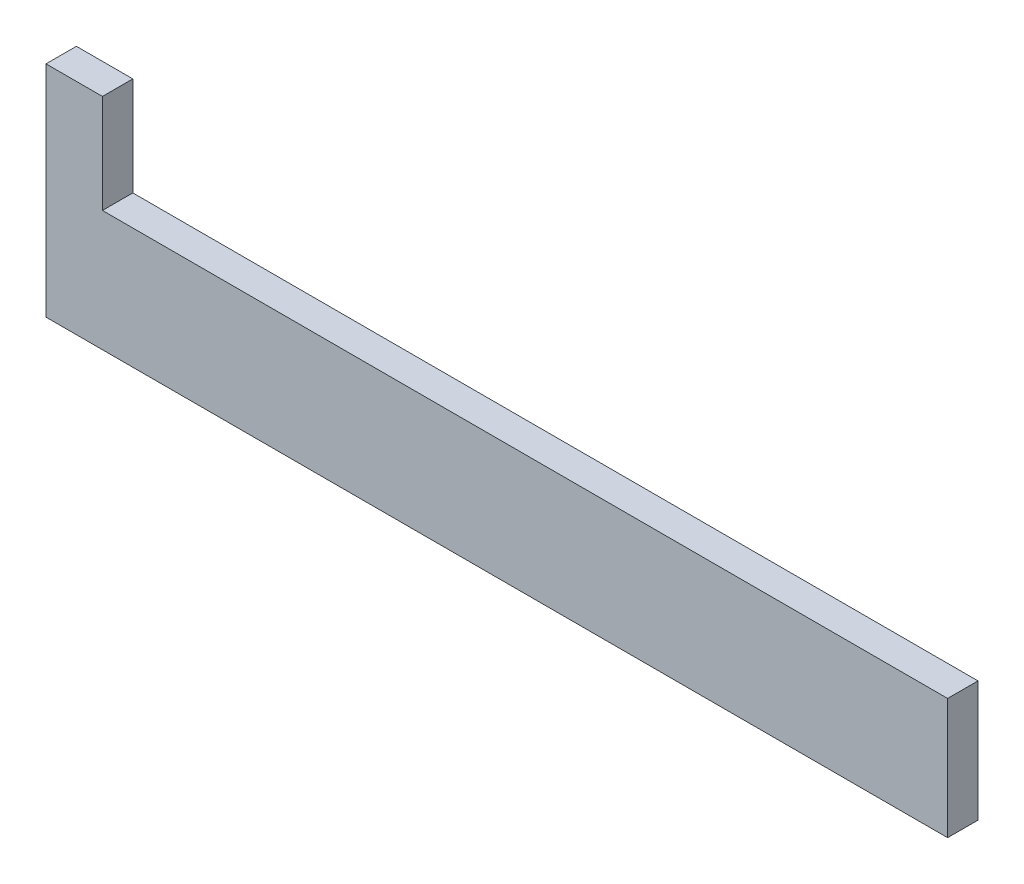
ISO-10303-21;
HEADER;
FILE_DESCRIPTION(('STEP AP214'),'2;1');
FILE_NAME('part.step','',(''),(''),'','','');
FILE_SCHEMA(('AUTOMOTIVE_DESIGN { 1 0 10303 214 1 1 1 1 }'));
ENDSEC;
DATA;
#1=APPLICATION_CONTEXT('core data for automotive mechanical design processes');
#2=APPLICATION_PROTOCOL_DEFINITION('international standard','automotive_design',2000,#1);
#3=PRODUCT_CONTEXT('',#1,'mechanical');
#4=PRODUCT('Part','Part','',(#3));
#5=PRODUCT_RELATED_PRODUCT_CATEGORY('part','',(#4));
#6=PRODUCT_DEFINITION_FORMATION('','',#4);
#7=PRODUCT_DEFINITION_CONTEXT('part definition',#1,'design');
#8=PRODUCT_DEFINITION('design','',#6,#7);
#9=PRODUCT_DEFINITION_SHAPE('','',#8);
#10=(LENGTH_UNIT() NAMED_UNIT(*) SI_UNIT(.MILLI.,.METRE.));
#11=(NAMED_UNIT(*) PLANE_ANGLE_UNIT() SI_UNIT($,.RADIAN.));
#12=(NAMED_UNIT(*) SI_UNIT($,.STERADIAN.) SOLID_ANGLE_UNIT());
#13=UNCERTAINTY_MEASURE_WITH_UNIT(LENGTH_MEASURE(1.E-05),#10,'distance_accuracy_value','');
#14=(GEOMETRIC_REPRESENTATION_CONTEXT(3) GLOBAL_UNCERTAINTY_ASSIGNED_CONTEXT((#13)) GLOBAL_UNIT_ASSIGNED_CONTEXT((#10,
#11,#12)) REPRESENTATION_CONTEXT('',''));
#15=CARTESIAN_POINT('',(0.,0.,0.));
#16=DIRECTION('',(0.,0.,1.));
#17=DIRECTION('',(1.,0.,0.));
#18=AXIS2_PLACEMENT_3D('',#15,#16,#17);
#19=CARTESIAN_POINT('',(24.,8.5489795,2.1536931));
#20=DIRECTION('',(0.,-1.,0.));
#21=DIRECTION('',(0.,0.,-1.));
#22=AXIS2_PLACEMENT_3D('',#19,#20,#21);
#23=PLANE('',#22);
#24=DIRECTION('',(-1.,0.,0.));
#25=VECTOR('',#24,1.);
#26=CARTESIAN_POINT('',(24.,8.5489795,0.));
#27=LINE('',#26,#25);
#28=CARTESIAN_POINT('',(35.9,8.5489795,0.));
#29=VERTEX_POINT('',#28);
#30=CARTESIAN_POINT('',(-24.,8.5489795,0.));
#31=VERTEX_POINT('',#30);
#32=EDGE_CURVE('E96',#29,#31,#27,.T.);
#33=ORIENTED_EDGE('',*,*,#32,.T.);
#34=DIRECTION('',(0.,0.,-1.));
#35=VECTOR('',#34,1.);
#36=CARTESIAN_POINT('',(-24.,8.5489795,2.1536931));
#37=LINE('',#36,#35);
#38=CARTESIAN_POINT('',(-24.,8.5489795,2.1536931));
#39=VERTEX_POINT('',#38);
#40=EDGE_CURVE('E11',#39,#31,#37,.T.);
#41=ORIENTED_EDGE('',*,*,#40,.F.);
#42=DIRECTION('',(-1.,0.,0.));
#43=VECTOR('',#42,1.);
#44=CARTESIAN_POINT('',(24.,8.5489795,2.1536931));
#45=LINE('',#44,#43);
#46=CARTESIAN_POINT('',(35.9,8.5489795,2.1536931));
#47=VERTEX_POINT('',#46);
#48=EDGE_CURVE('E82',#47,#39,#45,.T.);
#49=ORIENTED_EDGE('',*,*,#48,.F.);
#50=DIRECTION('',(0.,0.,1.));
#51=VECTOR('',#50,1.);
#52=CARTESIAN_POINT('',(35.9,8.5489795,0.));
#53=LINE('',#52,#51);
#54=EDGE_CURVE('E107',#29,#47,#53,.T.);
#55=ORIENTED_EDGE('',*,*,#54,.F.);
#56=EDGE_LOOP('',(#33,#41,#49,#55));
#57=FACE_BOUND('',#56,.T.);
#58=ADVANCED_FACE('F35',(#57),#23,.F.);
#59=CARTESIAN_POINT('',(-24.,15.5489795,2.1536931));
#60=DIRECTION('',(-1.,0.,0.));
#61=DIRECTION('',(0.,0.,1.));
#62=AXIS2_PLACEMENT_3D('',#59,#60,#61);
#63=PLANE('',#62);
#64=DIRECTION('',(0.,1.,0.));
#65=VECTOR('',#64,1.);
#66=CARTESIAN_POINT('',(-24.,15.5489795,0.));
#67=LINE('',#66,#65);
#68=CARTESIAN_POINT('',(-24.,15.5489795,0.));
#69=VERTEX_POINT('',#68);
#70=EDGE_CURVE('E102',#31,#69,#67,.T.);
#71=ORIENTED_EDGE('',*,*,#70,.T.);
#72=DIRECTION('',(0.,0.,-1.));
#73=VECTOR('',#72,1.);
#74=CARTESIAN_POINT('',(-24.,15.5489795,2.1536931));
#75=LINE('',#74,#73);
#76=CARTESIAN_POINT('',(-24.,15.5489795,2.1536931));
#77=VERTEX_POINT('',#76);
#78=EDGE_CURVE('E43',#77,#69,#75,.T.);
#79=ORIENTED_EDGE('',*,*,#78,.F.);
#80=DIRECTION('',(0.,1.,0.));
#81=VECTOR('',#80,1.);
#82=CARTESIAN_POINT('',(-24.,15.5489795,2.1536931));
#83=LINE('',#82,#81);
#84=EDGE_CURVE('E120',#39,#77,#83,.T.);
#85=ORIENTED_EDGE('',*,*,#84,.F.);
#86=ORIENTED_EDGE('',*,*,#40,.T.);
#87=EDGE_LOOP('',(#71,#79,#85,#86));
#88=FACE_BOUND('',#87,.T.);
#89=ADVANCED_FACE('F153',(#88),#63,.F.);
#90=CARTESIAN_POINT('',(-28.,15.5489795,2.1536931));
#91=DIRECTION('',(0.,-1.,0.));
#92=DIRECTION('',(0.,0.,-1.));
#93=AXIS2_PLACEMENT_3D('',#90,#91,#92);
#94=PLANE('',#93);
#95=DIRECTION('',(-1.,0.,0.));
#96=VECTOR('',#95,1.);
#97=CARTESIAN_POINT('',(-28.,15.5489795,0.));
#98=LINE('',#97,#96);
#99=CARTESIAN_POINT('',(-28.,15.5489795,0.));
#100=VERTEX_POINT('',#99);
#101=EDGE_CURVE('E69',#69,#100,#98,.T.);
#102=ORIENTED_EDGE('',*,*,#101,.T.);
#103=DIRECTION('',(0.,0.,-1.));
#104=VECTOR('',#103,1.);
#105=CARTESIAN_POINT('',(-28.,15.5489795,2.1536931));
#106=LINE('',#105,#104);
#107=CARTESIAN_POINT('',(-28.,15.5489795,2.1536931));
#108=VERTEX_POINT('',#107);
#109=EDGE_CURVE('E134',#108,#100,#106,.T.);
#110=ORIENTED_EDGE('',*,*,#109,.F.);
#111=DIRECTION('',(-1.,0.,0.));
#112=VECTOR('',#111,1.);
#113=CARTESIAN_POINT('',(-28.,15.5489795,2.1536931));
#114=LINE('',#113,#112);
#115=EDGE_CURVE('E123',#77,#108,#114,.T.);
#116=ORIENTED_EDGE('',*,*,#115,.F.);
#117=ORIENTED_EDGE('',*,*,#78,.T.);
#118=EDGE_LOOP('',(#102,#110,#116,#117));
#119=FACE_BOUND('',#118,.T.);
#120=ADVANCED_FACE('F137',(#119),#94,.F.);
#121=CARTESIAN_POINT('',(-28.,0.,2.1536931));
#122=DIRECTION('',(1.,0.,0.));
#123=DIRECTION('',(0.,0.,-1.));
#124=AXIS2_PLACEMENT_3D('',#121,#122,#123);
#125=PLANE('',#124);
#126=DIRECTION('',(0.,-1.,0.));
#127=VECTOR('',#126,1.);
#128=CARTESIAN_POINT('',(-28.,0.,0.));
#129=LINE('',#128,#127);
#130=CARTESIAN_POINT('',(-28.,0.,0.));
#131=VERTEX_POINT('',#130);
#132=EDGE_CURVE('E75',#100,#131,#129,.T.);
#133=ORIENTED_EDGE('',*,*,#132,.T.);
#134=DIRECTION('',(0.,0.,-1.));
#135=VECTOR('',#134,1.);
#136=CARTESIAN_POINT('',(-28.,0.,2.1536931));
#137=LINE('',#136,#135);
#138=CARTESIAN_POINT('',(-28.,0.,2.1536931));
#139=VERTEX_POINT('',#138);
#140=EDGE_CURVE('E127',#139,#131,#137,.T.);
#141=ORIENTED_EDGE('',*,*,#140,.F.);
#142=DIRECTION('',(0.,-1.,0.));
#143=VECTOR('',#142,1.);
#144=CARTESIAN_POINT('',(-28.,0.,2.1536931));
#145=LINE('',#144,#143);
#146=EDGE_CURVE('E51',#108,#139,#145,.T.);
#147=ORIENTED_EDGE('',*,*,#146,.F.);
#148=ORIENTED_EDGE('',*,*,#109,.T.);
#149=EDGE_LOOP('',(#133,#141,#147,#148));
#150=FACE_BOUND('',#149,.T.);
#151=ADVANCED_FACE('F143',(#150),#125,.F.);
#152=CARTESIAN_POINT('',(28.,0.,2.1536931));
#153=DIRECTION('',(0.,1.,0.));
#154=DIRECTION('',(0.,0.,1.));
#155=AXIS2_PLACEMENT_3D('',#152,#153,#154);
#156=PLANE('',#155);
#157=DIRECTION('',(1.,0.,0.));
#158=VECTOR('',#157,1.);
#159=CARTESIAN_POINT('',(28.,0.,0.));
#160=LINE('',#159,#158);
#161=CARTESIAN_POINT('',(35.9,0.,0.));
#162=VERTEX_POINT('',#161);
#163=EDGE_CURVE('E121',#131,#162,#160,.T.);
#164=ORIENTED_EDGE('',*,*,#163,.T.);
#165=DIRECTION('',(0.,0.,-1.));
#166=VECTOR('',#165,1.);
#167=CARTESIAN_POINT('',(35.9,0.,0.));
#168=LINE('',#167,#166);
#169=CARTESIAN_POINT('',(35.9,0.,2.1536931));
#170=VERTEX_POINT('',#169);
#171=EDGE_CURVE('E104',#170,#162,#168,.T.);
#172=ORIENTED_EDGE('',*,*,#171,.F.);
#173=DIRECTION('',(1.,0.,0.));
#174=VECTOR('',#173,1.);
#175=CARTESIAN_POINT('',(28.,0.,2.1536931));
#176=LINE('',#175,#174);
#177=EDGE_CURVE('E126',#139,#170,#176,.T.);
#178=ORIENTED_EDGE('',*,*,#177,.F.);
#179=ORIENTED_EDGE('',*,*,#140,.T.);
#180=EDGE_LOOP('',(#164,#172,#178,#179));
#181=FACE_BOUND('',#180,.T.);
#182=ADVANCED_FACE('F141',(#181),#156,.F.);
#183=CARTESIAN_POINT('',(0.,0.,2.1536931));
#184=DIRECTION('',(0.,0.,1.));
#185=DIRECTION('',(1.,0.,0.));
#186=AXIS2_PLACEMENT_3D('',#183,#184,#185);
#187=PLANE('',#186);
#188=ORIENTED_EDGE('',*,*,#177,.T.);
#189=DIRECTION('',(0.,-1.,0.));
#190=VECTOR('',#189,1.);
#191=CARTESIAN_POINT('',(35.9,8.5489795,2.1536931));
#192=LINE('',#191,#190);
#193=EDGE_CURVE('E110',#47,#170,#192,.T.);
#194=ORIENTED_EDGE('',*,*,#193,.F.);
#195=ORIENTED_EDGE('',*,*,#48,.T.);
#196=ORIENTED_EDGE('',*,*,#84,.T.);
#197=ORIENTED_EDGE('',*,*,#115,.T.);
#198=ORIENTED_EDGE('',*,*,#146,.T.);
#199=EDGE_LOOP('',(#188,#194,#195,#196,#197,#198));
#200=FACE_BOUND('',#199,.T.);
#201=ADVANCED_FACE('F151',(#200),#187,.T.);
#202=CARTESIAN_POINT('',(0.,0.,0.));
#203=DIRECTION('',(0.,0.,1.));
#204=DIRECTION('',(1.,0.,0.));
#205=AXIS2_PLACEMENT_3D('',#202,#203,#204);
#206=PLANE('',#205);
#207=ORIENTED_EDGE('',*,*,#32,.F.);
#208=DIRECTION('',(0.,1.,0.));
#209=VECTOR('',#208,1.);
#210=CARTESIAN_POINT('',(35.9,8.5489795,0.));
#211=LINE('',#210,#209);
#212=EDGE_CURVE('E101',#162,#29,#211,.T.);
#213=ORIENTED_EDGE('',*,*,#212,.F.);
#214=ORIENTED_EDGE('',*,*,#163,.F.);
#215=ORIENTED_EDGE('',*,*,#132,.F.);
#216=ORIENTED_EDGE('',*,*,#101,.F.);
#217=ORIENTED_EDGE('',*,*,#70,.F.);
#218=EDGE_LOOP('',(#207,#213,#214,#215,#216,#217));
#219=FACE_BOUND('',#218,.T.);
#220=ADVANCED_FACE('F98',(#219),#206,.F.);
#221=CARTESIAN_POINT('',(35.9,0.,0.));
#222=DIRECTION('',(-1.,0.,0.));
#223=DIRECTION('',(0.,0.,1.));
#224=AXIS2_PLACEMENT_3D('',#221,#222,#223);
#225=PLANE('',#224);
#226=ORIENTED_EDGE('',*,*,#212,.T.);
#227=ORIENTED_EDGE('',*,*,#54,.T.);
#228=ORIENTED_EDGE('',*,*,#193,.T.);
#229=ORIENTED_EDGE('',*,*,#171,.T.);
#230=EDGE_LOOP('',(#226,#227,#228,#229));
#231=FACE_BOUND('',#230,.T.);
#232=ADVANCED_FACE('F113',(#231),#225,.F.);
#233=CLOSED_SHELL('',(#58,#89,#120,#151,#182,#201,#220,#232));
#234=MANIFOLD_SOLID_BREP('B2',#233);
#235=ADVANCED_BREP_SHAPE_REPRESENTATION('',(#18,#234),#14);
#236=SHAPE_DEFINITION_REPRESENTATION(#9,#235);
ENDSEC;
END-ISO-10303-21;
